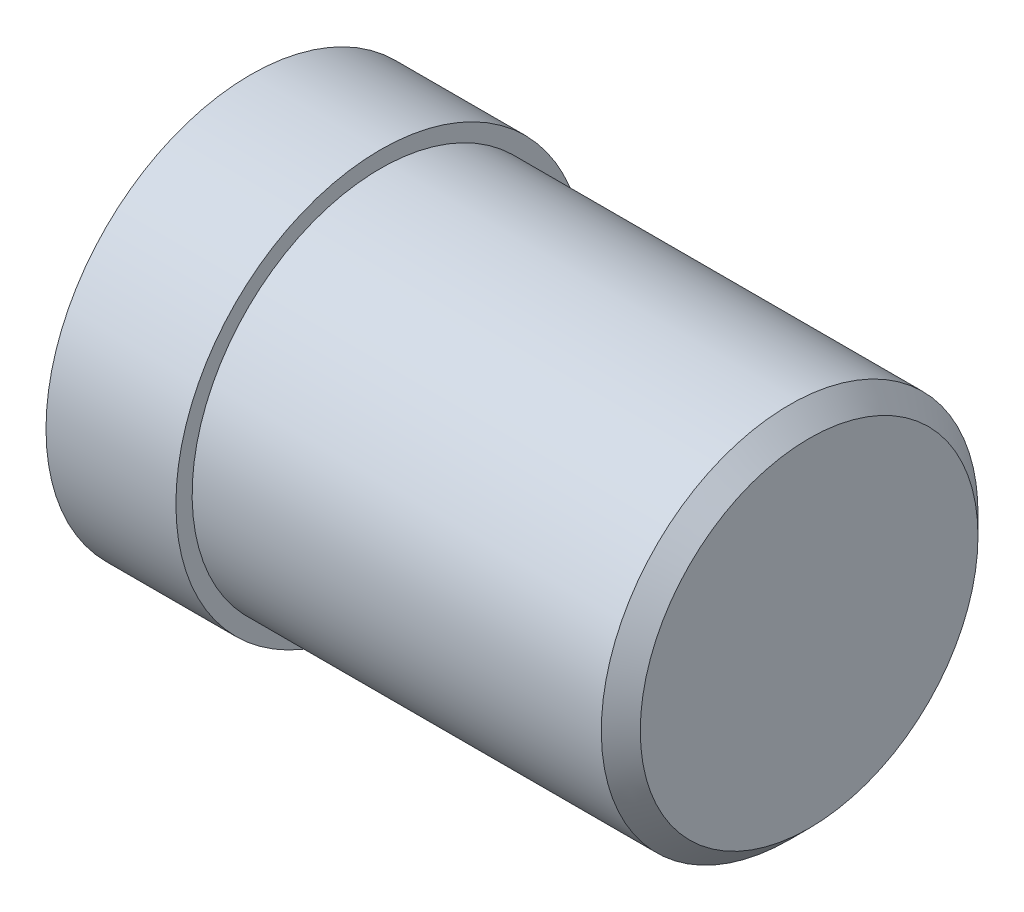
ISO-10303-21;
HEADER;
FILE_DESCRIPTION(('STEP AP214'),'2;1');
FILE_NAME('part.step','',(''),(''),'','','');
FILE_SCHEMA(('AUTOMOTIVE_DESIGN { 1 0 10303 214 1 1 1 1 }'));
ENDSEC;
DATA;
#1=APPLICATION_CONTEXT('core data for automotive mechanical design processes');
#2=APPLICATION_PROTOCOL_DEFINITION('international standard','automotive_design',2000,#1);
#3=PRODUCT_CONTEXT('',#1,'mechanical');
#4=PRODUCT('Part','Part','',(#3));
#5=PRODUCT_RELATED_PRODUCT_CATEGORY('part','',(#4));
#6=PRODUCT_DEFINITION_FORMATION('','',#4);
#7=PRODUCT_DEFINITION_CONTEXT('part definition',#1,'design');
#8=PRODUCT_DEFINITION('design','',#6,#7);
#9=PRODUCT_DEFINITION_SHAPE('','',#8);
#10=(LENGTH_UNIT() NAMED_UNIT(*) SI_UNIT(.MILLI.,.METRE.));
#11=(NAMED_UNIT(*) PLANE_ANGLE_UNIT() SI_UNIT($,.RADIAN.));
#12=(NAMED_UNIT(*) SI_UNIT($,.STERADIAN.) SOLID_ANGLE_UNIT());
#13=UNCERTAINTY_MEASURE_WITH_UNIT(LENGTH_MEASURE(1.E-05),#10,'distance_accuracy_value','');
#14=(GEOMETRIC_REPRESENTATION_CONTEXT(3) GLOBAL_UNCERTAINTY_ASSIGNED_CONTEXT((#13)) GLOBAL_UNIT_ASSIGNED_CONTEXT((#10,
#11,#12)) REPRESENTATION_CONTEXT('',''));
#15=CARTESIAN_POINT('',(0.,0.,0.));
#16=DIRECTION('',(0.,0.,1.));
#17=DIRECTION('',(1.,0.,0.));
#18=AXIS2_PLACEMENT_3D('',#15,#16,#17);
#19=CARTESIAN_POINT('',(0.,3.15,0.));
#20=DIRECTION('',(1.,0.,0.));
#21=DIRECTION('',(0.,1.,0.));
#22=AXIS2_PLACEMENT_3D('',#19,#20,#21);
#23=PLANE('',#22);
#24=CARTESIAN_POINT('',(0.,0.,0.));
#25=DIRECTION('',(1.,0.,0.));
#26=DIRECTION('',(0.,0.,-1.));
#27=AXIS2_PLACEMENT_3D('',#24,#25,#26);
#28=CIRCLE('',#27,2.84886701472723);
#29=CARTESIAN_POINT('',(0.,0.,-2.84886701472723));
#30=VERTEX_POINT('',#29);
#31=EDGE_CURVE('E81',#30,#30,#28,.T.);
#32=ORIENTED_EDGE('',*,*,#31,.T.);
#33=EDGE_LOOP('',(#32));
#34=FACE_BOUND('',#33,.T.);
#35=CARTESIAN_POINT('',(0.,0.,0.));
#36=DIRECTION('',(-1.,0.,0.));
#37=DIRECTION('',(0.,-1.,0.));
#38=AXIS2_PLACEMENT_3D('',#35,#36,#37);
#39=CIRCLE('',#38,3.15);
#40=CARTESIAN_POINT('',(0.,-3.15,0.));
#41=VERTEX_POINT('',#40);
#42=EDGE_CURVE('E57',#41,#41,#39,.T.);
#43=ORIENTED_EDGE('',*,*,#42,.T.);
#44=EDGE_LOOP('',(#43));
#45=FACE_BOUND('',#44,.T.);
#46=ADVANCED_FACE('F48',(#34,#45),#23,.F.);
#47=CARTESIAN_POINT('',(0.,0.,0.));
#48=DIRECTION('',(-1.,0.,0.));
#49=DIRECTION('',(0.,-1.,0.));
#50=AXIS2_PLACEMENT_3D('',#47,#48,#49);
#51=CYLINDRICAL_SURFACE('',#50,3.15);
#52=ORIENTED_EDGE('',*,*,#42,.F.);
#53=EDGE_LOOP('',(#52));
#54=FACE_BOUND('',#53,.T.);
#55=CARTESIAN_POINT('',(2.,0.,0.));
#56=DIRECTION('',(-1.,0.,0.));
#57=DIRECTION('',(0.,-1.,0.));
#58=AXIS2_PLACEMENT_3D('',#55,#56,#57);
#59=CIRCLE('',#58,3.15);
#60=CARTESIAN_POINT('',(2.,-3.15,0.));
#61=VERTEX_POINT('',#60);
#62=EDGE_CURVE('E63',#61,#61,#59,.T.);
#63=ORIENTED_EDGE('',*,*,#62,.T.);
#64=EDGE_LOOP('',(#63));
#65=FACE_BOUND('',#64,.T.);
#66=ADVANCED_FACE('F114',(#54,#65),#51,.T.);
#67=CARTESIAN_POINT('',(2.,3.15,0.));
#68=DIRECTION('',(-1.,0.,0.));
#69=DIRECTION('',(0.,-1.,0.));
#70=AXIS2_PLACEMENT_3D('',#67,#68,#69);
#71=PLANE('',#70);
#72=ORIENTED_EDGE('',*,*,#62,.F.);
#73=EDGE_LOOP('',(#72));
#74=FACE_BOUND('',#73,.T.);
#75=CARTESIAN_POINT('',(2.,0.,0.));
#76=DIRECTION('',(-1.,0.,0.));
#77=DIRECTION('',(0.,-1.,0.));
#78=AXIS2_PLACEMENT_3D('',#75,#76,#77);
#79=CIRCLE('',#78,2.9);
#80=CARTESIAN_POINT('',(2.,-2.9,0.));
#81=VERTEX_POINT('',#80);
#82=EDGE_CURVE('E69',#81,#81,#79,.T.);
#83=ORIENTED_EDGE('',*,*,#82,.T.);
#84=EDGE_LOOP('',(#83));
#85=FACE_BOUND('',#84,.T.);
#86=ADVANCED_FACE('F120',(#74,#85),#71,.F.);
#87=CARTESIAN_POINT('',(0.,0.,0.));
#88=DIRECTION('',(-1.,0.,0.));
#89=DIRECTION('',(0.,-1.,0.));
#90=AXIS2_PLACEMENT_3D('',#87,#88,#89);
#91=CYLINDRICAL_SURFACE('',#90,2.9);
#92=ORIENTED_EDGE('',*,*,#82,.F.);
#93=EDGE_LOOP('',(#92));
#94=FACE_BOUND('',#93,.T.);
#95=CARTESIAN_POINT('',(8.3,0.,0.));
#96=DIRECTION('',(-1.,0.,0.));
#97=DIRECTION('',(0.,-1.,0.));
#98=AXIS2_PLACEMENT_3D('',#95,#96,#97);
#99=CIRCLE('',#98,2.9);
#100=CARTESIAN_POINT('',(8.3,-2.9,0.));
#101=VERTEX_POINT('',#100);
#102=EDGE_CURVE('E73',#101,#101,#99,.T.);
#103=ORIENTED_EDGE('',*,*,#102,.T.);
#104=EDGE_LOOP('',(#103));
#105=FACE_BOUND('',#104,.T.);
#106=ADVANCED_FACE('F155',(#94,#105),#91,.T.);
#107=CARTESIAN_POINT('',(8.6,0.,0.));
#108=DIRECTION('',(-1.,0.,0.));
#109=DIRECTION('',(0.,-1.,0.));
#110=AXIS2_PLACEMENT_3D('',#107,#108,#109);
#111=CONICAL_SURFACE('',#110,2.6,0.785398163397448);
#112=ORIENTED_EDGE('',*,*,#102,.F.);
#113=EDGE_LOOP('',(#112));
#114=FACE_BOUND('',#113,.T.);
#115=CARTESIAN_POINT('',(8.6,0.,0.));
#116=DIRECTION('',(-1.,0.,0.));
#117=DIRECTION('',(0.,-1.,0.));
#118=AXIS2_PLACEMENT_3D('',#115,#116,#117);
#119=CIRCLE('',#118,2.6);
#120=CARTESIAN_POINT('',(8.6,-2.6,0.));
#121=VERTEX_POINT('',#120);
#122=EDGE_CURVE('E77',#121,#121,#119,.T.);
#123=ORIENTED_EDGE('',*,*,#122,.T.);
#124=EDGE_LOOP('',(#123));
#125=FACE_BOUND('',#124,.T.);
#126=ADVANCED_FACE('F110',(#114,#125),#111,.T.);
#127=CARTESIAN_POINT('',(8.6,2.55000000000001,0.));
#128=DIRECTION('',(-1.,0.,0.));
#129=DIRECTION('',(0.,-1.,0.));
#130=AXIS2_PLACEMENT_3D('',#127,#128,#129);
#131=PLANE('',#130);
#132=ORIENTED_EDGE('',*,*,#122,.F.);
#133=EDGE_LOOP('',(#132));
#134=FACE_BOUND('',#133,.T.);
#135=ADVANCED_FACE('F102',(#134),#131,.F.);
#136=CARTESIAN_POINT('',(0.199999999999999,0.,0.));
#137=DIRECTION('',(1.,0.,0.));
#138=DIRECTION('',(0.,0.,-1.));
#139=AXIS2_PLACEMENT_3D('',#136,#137,#138);
#140=PLANE('',#139);
#141=CARTESIAN_POINT('',(0.199999999999999,0.,0.));
#142=DIRECTION('',(1.,0.,0.));
#143=DIRECTION('',(0.,0.,-1.));
#144=AXIS2_PLACEMENT_3D('',#141,#142,#143);
#145=CIRCLE('',#144,2.84886701472723);
#146=CARTESIAN_POINT('',(0.199999999999999,0.,-2.84886701472723));
#147=VERTEX_POINT('',#146);
#148=EDGE_CURVE('E85',#147,#147,#145,.T.);
#149=ORIENTED_EDGE('',*,*,#148,.F.);
#150=EDGE_LOOP('',(#149));
#151=FACE_BOUND('',#150,.T.);
#152=CARTESIAN_POINT('',(0.199999999999999,0.,0.));
#153=DIRECTION('',(1.,0.,0.));
#154=DIRECTION('',(0.,0.,-1.));
#155=AXIS2_PLACEMENT_3D('',#152,#153,#154);
#156=CIRCLE('',#155,2.55);
#157=CARTESIAN_POINT('',(0.199999999999999,0.,-2.55));
#158=VERTEX_POINT('',#157);
#159=EDGE_CURVE('E52',#158,#158,#156,.F.);
#160=ORIENTED_EDGE('',*,*,#159,.F.);
#161=EDGE_LOOP('',(#160));
#162=FACE_BOUND('',#161,.T.);
#163=ADVANCED_FACE('F99',(#151,#162),#140,.F.);
#164=CARTESIAN_POINT('',(0.199999999999999,0.,0.));
#165=DIRECTION('',(-1.,0.,0.));
#166=DIRECTION('',(0.,0.,1.));
#167=AXIS2_PLACEMENT_3D('',#164,#165,#166);
#168=CYLINDRICAL_SURFACE('',#167,2.84886701472723);
#169=ORIENTED_EDGE('',*,*,#148,.T.);
#170=EDGE_LOOP('',(#169));
#171=FACE_BOUND('',#170,.T.);
#172=ORIENTED_EDGE('',*,*,#31,.F.);
#173=EDGE_LOOP('',(#172));
#174=FACE_BOUND('',#173,.T.);
#175=ADVANCED_FACE('F101',(#171,#174),#168,.F.);
#176=CARTESIAN_POINT('',(8.44999999999999,0.,0.));
#177=DIRECTION('',(1.,0.,0.));
#178=DIRECTION('',(0.,1.,0.));
#179=AXIS2_PLACEMENT_3D('',#176,#177,#178);
#180=PLANE('',#179);
#181=CARTESIAN_POINT('',(8.44999999999999,0.,0.));
#182=DIRECTION('',(-1.,0.,0.));
#183=DIRECTION('',(0.,-1.,0.));
#184=AXIS2_PLACEMENT_3D('',#181,#182,#183);
#185=CIRCLE('',#184,2.55);
#186=CARTESIAN_POINT('',(8.44999999999999,-2.55,0.));
#187=VERTEX_POINT('',#186);
#188=EDGE_CURVE('E12',#187,#187,#185,.T.);
#189=ORIENTED_EDGE('',*,*,#188,.T.);
#190=EDGE_LOOP('',(#189));
#191=FACE_BOUND('',#190,.T.);
#192=ADVANCED_FACE('F50',(#191),#180,.F.);
#193=CARTESIAN_POINT('',(0.,0.,0.));
#194=DIRECTION('',(-1.,0.,0.));
#195=DIRECTION('',(0.,-1.,0.));
#196=AXIS2_PLACEMENT_3D('',#193,#194,#195);
#197=CYLINDRICAL_SURFACE('',#196,2.55);
#198=ORIENTED_EDGE('',*,*,#159,.T.);
#199=EDGE_LOOP('',(#198));
#200=FACE_BOUND('',#199,.T.);
#201=ORIENTED_EDGE('',*,*,#188,.F.);
#202=EDGE_LOOP('',(#201));
#203=FACE_BOUND('',#202,.T.);
#204=ADVANCED_FACE('F96',(#200,#203),#197,.F.);
#205=CLOSED_SHELL('',(#46,#66,#86,#106,#126,#135,#163,#175,#192,#204));
#206=MANIFOLD_SOLID_BREP('B2',#205);
#207=ADVANCED_BREP_SHAPE_REPRESENTATION('',(#18,#206),#14);
#208=SHAPE_DEFINITION_REPRESENTATION(#9,#207);
ENDSEC;
END-ISO-10303-21;
